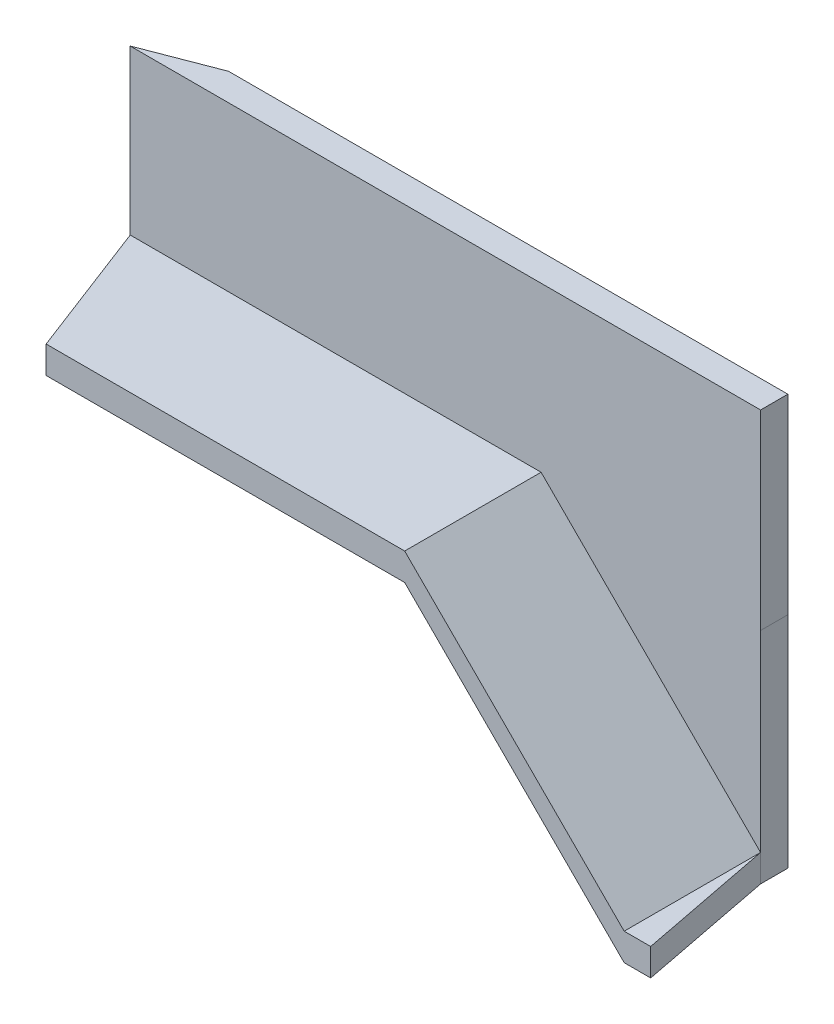
ISO-10303-21;
HEADER;
FILE_DESCRIPTION(('STEP AP214'),'2;1');
FILE_NAME('part.step','',(''),(''),'','','');
FILE_SCHEMA(('AUTOMOTIVE_DESIGN { 1 0 10303 214 1 1 1 1 }'));
ENDSEC;
DATA;
#1=APPLICATION_CONTEXT('core data for automotive mechanical design processes');
#2=APPLICATION_PROTOCOL_DEFINITION('international standard','automotive_design',2000,#1);
#3=PRODUCT_CONTEXT('',#1,'mechanical');
#4=PRODUCT('Part','Part','',(#3));
#5=PRODUCT_RELATED_PRODUCT_CATEGORY('part','',(#4));
#6=PRODUCT_DEFINITION_FORMATION('','',#4);
#7=PRODUCT_DEFINITION_CONTEXT('part definition',#1,'design');
#8=PRODUCT_DEFINITION('design','',#6,#7);
#9=PRODUCT_DEFINITION_SHAPE('','',#8);
#10=(LENGTH_UNIT() NAMED_UNIT(*) SI_UNIT(.MILLI.,.METRE.));
#11=(NAMED_UNIT(*) PLANE_ANGLE_UNIT() SI_UNIT($,.RADIAN.));
#12=(NAMED_UNIT(*) SI_UNIT($,.STERADIAN.) SOLID_ANGLE_UNIT());
#13=UNCERTAINTY_MEASURE_WITH_UNIT(LENGTH_MEASURE(1.E-05),#10,'distance_accuracy_value','');
#14=(GEOMETRIC_REPRESENTATION_CONTEXT(3) GLOBAL_UNCERTAINTY_ASSIGNED_CONTEXT((#13)) GLOBAL_UNIT_ASSIGNED_CONTEXT((#10,
#11,#12)) REPRESENTATION_CONTEXT('',''));
#15=CARTESIAN_POINT('',(0.,0.,0.));
#16=DIRECTION('',(0.,0.,1.));
#17=DIRECTION('',(1.,0.,0.));
#18=AXIS2_PLACEMENT_3D('',#15,#16,#17);
#19=CARTESIAN_POINT('',(0.,-15.3089430894309,2.));
#20=DIRECTION('',(0.,0.,1.));
#21=DIRECTION('',(1.,0.,0.));
#22=AXIS2_PLACEMENT_3D('',#19,#20,#21);
#23=PLANE('',#22);
#24=DIRECTION('',(3.40150407365471E-05,-0.999999999421489,0.));
#25=VECTOR('',#24,1.);
#26=CARTESIAN_POINT('',(22.8216855133879,-37.7444715447155,2.));
#27=LINE('',#26,#25);
#28=CARTESIAN_POINT('',(22.8211382113821,-21.6544715447155,2.));
#29=VERTEX_POINT('',#28);
#30=CARTESIAN_POINT('',(22.8214976653253,-35.7444715458725,2.0018487571625));
#31=VERTEX_POINT('',#30);
#32=EDGE_CURVE('E229',#29,#31,#27,.T.);
#33=ORIENTED_EDGE('',*,*,#32,.F.);
#34=DIRECTION('',(0.,-1.,0.));
#35=VECTOR('',#34,1.);
#36=CARTESIAN_POINT('',(22.8211382113821,-21.6544715447155,2.));
#37=LINE('',#36,#35);
#38=CARTESIAN_POINT('',(22.8211382113821,-7.65447154471545,2.));
#39=VERTEX_POINT('',#38);
#40=EDGE_CURVE('E209',#39,#29,#37,.T.);
#41=ORIENTED_EDGE('',*,*,#40,.F.);
#42=DIRECTION('',(1.,0.,0.));
#43=VECTOR('',#42,1.);
#44=CARTESIAN_POINT('',(-46.1788617886179,-7.65447154471545,2.));
#45=LINE('',#44,#43);
#46=CARTESIAN_POINT('',(-23.3890399180056,-7.65447154471545,2.));
#47=VERTEX_POINT('',#46);
#48=EDGE_CURVE('E213',#47,#39,#45,.T.);
#49=ORIENTED_EDGE('',*,*,#48,.F.);
#50=DIRECTION('',(0.,1.,0.));
#51=VECTOR('',#50,1.);
#52=CARTESIAN_POINT('',(-23.3890399180056,-15.3089430894309,2.));
#53=LINE('',#52,#51);
#54=CARTESIAN_POINT('',(-23.3890399180056,-19.6544715447155,2.));
#55=VERTEX_POINT('',#54);
#56=EDGE_CURVE('E216',#55,#47,#53,.T.);
#57=ORIENTED_EDGE('',*,*,#56,.F.);
#58=DIRECTION('',(1.,0.,0.));
#59=VECTOR('',#58,1.);
#60=CARTESIAN_POINT('',(-46.1788617886179,-19.6544715447155,2.));
#61=LINE('',#60,#59);
#62=CARTESIAN_POINT('',(6.73168551338772,-19.6544715447155,2.));
#63=VERTEX_POINT('',#62);
#64=EDGE_CURVE('E205',#55,#63,#61,.T.);
#65=ORIENTED_EDGE('',*,*,#64,.T.);
#66=DIRECTION('',(0.707105286298341,-0.707108276071594,0.));
#67=VECTOR('',#66,1.);
#68=CARTESIAN_POINT('',(6.73168551338772,-19.6544715447155,2.));
#69=LINE('',#68,#67);
#70=EDGE_CURVE('E218',#63,#31,#69,.T.);
#71=ORIENTED_EDGE('',*,*,#70,.T.);
#72=EDGE_LOOP('',(#33,#41,#49,#57,#65,#71));
#73=FACE_BOUND('',#72,.T.);
#74=ADVANCED_FACE('F40',(#73),#23,.T.);
#75=CARTESIAN_POINT('',(-46.1788617886179,-21.6544715447155,2.));
#76=DIRECTION('',(0.,1.,0.));
#77=DIRECTION('',(0.,0.,-1.));
#78=AXIS2_PLACEMENT_3D('',#75,#76,#77);
#79=PLANE('',#78);
#80=DIRECTION('',(0.933580426497204,0.,-0.358367949545294));
#81=VECTOR('',#80,1.);
#82=CARTESIAN_POINT('',(-43.2520199516604,-21.6544715447155,9.62468366354648));
#83=LINE('',#82,#81);
#84=CARTESIAN_POINT('',(-23.3890399180056,-21.6544715447155,2.));
#85=VERTEX_POINT('',#84);
#86=CARTESIAN_POINT('',(-18.1788617886179,-21.6544715447155,0.));
#87=VERTEX_POINT('',#86);
#88=EDGE_CURVE('E192',#85,#87,#83,.T.);
#89=ORIENTED_EDGE('',*,*,#88,.T.);
#90=DIRECTION('',(-1.,0.,0.));
#91=VECTOR('',#90,1.);
#92=CARTESIAN_POINT('',(-46.1788617886179,-21.6544715447155,0.));
#93=LINE('',#92,#91);
#94=CARTESIAN_POINT('',(6.73168551338772,-21.6544715447155,0.));
#95=VERTEX_POINT('',#94);
#96=EDGE_CURVE('E198',#95,#87,#93,.T.);
#97=ORIENTED_EDGE('',*,*,#96,.F.);
#98=DIRECTION('',(0.,0.,-1.));
#99=VECTOR('',#98,1.);
#100=CARTESIAN_POINT('',(6.73168551338772,-21.6544715447155,6.));
#101=LINE('',#100,#99);
#102=CARTESIAN_POINT('',(6.73168551338772,-21.6544715447155,12.));
#103=VERTEX_POINT('',#102);
#104=EDGE_CURVE('E202',#103,#95,#101,.T.);
#105=ORIENTED_EDGE('',*,*,#104,.F.);
#106=DIRECTION('',(-1.,0.,0.));
#107=VECTOR('',#106,1.);
#108=CARTESIAN_POINT('',(6.73168551338772,-21.6544715447155,12.));
#109=LINE('',#108,#107);
#110=CARTESIAN_POINT('',(-19.551979619052,-21.6544715447155,12.));
#111=VERTEX_POINT('',#110);
#112=EDGE_CURVE('E239',#103,#111,#109,.T.);
#113=ORIENTED_EDGE('',*,*,#112,.T.);
#114=DIRECTION('',(0.358239373263557,0.,0.933629772149396));
#115=VECTOR('',#114,1.);
#116=CARTESIAN_POINT('',(-26.313781930288,-21.6544715447155,-5.6223509259941));
#117=LINE('',#116,#115);
#118=EDGE_CURVE('E212',#85,#111,#117,.T.);
#119=ORIENTED_EDGE('',*,*,#118,.F.);
#120=EDGE_LOOP('',(#89,#97,#105,#113,#119));
#121=FACE_BOUND('',#120,.T.);
#122=ADVANCED_FACE('F42',(#121),#79,.F.);
#123=CARTESIAN_POINT('',(-46.1788617886179,-7.65447154471545,2.));
#124=DIRECTION('',(0.,-1.,0.));
#125=DIRECTION('',(0.,0.,1.));
#126=AXIS2_PLACEMENT_3D('',#123,#124,#125);
#127=PLANE('',#126);
#128=DIRECTION('',(-0.933580426497204,0.,0.358367949545294));
#129=VECTOR('',#128,1.);
#130=CARTESIAN_POINT('',(-43.2520199516604,-7.65447154471545,9.62468366354648));
#131=LINE('',#130,#129);
#132=CARTESIAN_POINT('',(-18.1788617886179,-7.65447154471545,0.));
#133=VERTEX_POINT('',#132);
#134=EDGE_CURVE('E223',#133,#47,#131,.T.);
#135=ORIENTED_EDGE('',*,*,#134,.T.);
#136=ORIENTED_EDGE('',*,*,#48,.T.);
#137=DIRECTION('',(0.,0.,-1.));
#138=VECTOR('',#137,1.);
#139=CARTESIAN_POINT('',(22.8211382113821,-7.65447154471545,2.));
#140=LINE('',#139,#138);
#141=CARTESIAN_POINT('',(22.8211382113821,-7.65447154471545,0.));
#142=VERTEX_POINT('',#141);
#143=EDGE_CURVE('E189',#39,#142,#140,.T.);
#144=ORIENTED_EDGE('',*,*,#143,.T.);
#145=DIRECTION('',(1.,0.,0.));
#146=VECTOR('',#145,1.);
#147=CARTESIAN_POINT('',(-46.1788617886179,-7.65447154471545,0.));
#148=LINE('',#147,#146);
#149=EDGE_CURVE('E201',#133,#142,#148,.T.);
#150=ORIENTED_EDGE('',*,*,#149,.F.);
#151=EDGE_LOOP('',(#135,#136,#144,#150));
#152=FACE_BOUND('',#151,.T.);
#153=ADVANCED_FACE('F297',(#152),#127,.F.);
#154=CARTESIAN_POINT('',(0.,-15.3089430894309,0.));
#155=DIRECTION('',(0.,0.,1.));
#156=DIRECTION('',(1.,0.,0.));
#157=AXIS2_PLACEMENT_3D('',#154,#155,#156);
#158=PLANE('',#157);
#159=DIRECTION('',(0.,1.,0.));
#160=VECTOR('',#159,1.);
#161=CARTESIAN_POINT('',(-18.1788617886179,-41.6544715447154,0.));
#162=LINE('',#161,#160);
#163=EDGE_CURVE('E226',#87,#133,#162,.T.);
#164=ORIENTED_EDGE('',*,*,#163,.T.);
#165=ORIENTED_EDGE('',*,*,#149,.T.);
#166=DIRECTION('',(0.,-1.,0.));
#167=VECTOR('',#166,1.);
#168=CARTESIAN_POINT('',(22.8211382113821,-21.6544715447155,0.));
#169=LINE('',#168,#167);
#170=CARTESIAN_POINT('',(22.8211382113821,-21.6544715447155,0.));
#171=VERTEX_POINT('',#170);
#172=EDGE_CURVE('E193',#142,#171,#169,.T.);
#173=ORIENTED_EDGE('',*,*,#172,.T.);
#174=DIRECTION('',(-3.40150407365471E-05,0.999999999421489,0.));
#175=VECTOR('',#174,1.);
#176=CARTESIAN_POINT('',(22.8216855133879,-37.7444715447155,0.));
#177=LINE('',#176,#175);
#178=CARTESIAN_POINT('',(22.8216855133879,-37.7444715447155,0.));
#179=VERTEX_POINT('',#178);
#180=EDGE_CURVE('E222',#179,#171,#177,.T.);
#181=ORIENTED_EDGE('',*,*,#180,.F.);
#182=DIRECTION('',(0.707106781186551,-0.707106781186544,0.));
#183=VECTOR('',#182,1.);
#184=CARTESIAN_POINT('',(6.73168551338772,-21.6544715447155,0.));
#185=LINE('',#184,#183);
#186=EDGE_CURVE('E208',#95,#179,#185,.T.);
#187=ORIENTED_EDGE('',*,*,#186,.F.);
#188=ORIENTED_EDGE('',*,*,#96,.T.);
#189=EDGE_LOOP('',(#164,#165,#173,#181,#187,#188));
#190=FACE_BOUND('',#189,.T.);
#191=ADVANCED_FACE('F289',(#190),#158,.F.);
#192=CARTESIAN_POINT('',(-46.1788617886179,-19.6544715447155,6.));
#193=DIRECTION('',(0.,-1.,0.));
#194=DIRECTION('',(0.,0.,1.));
#195=AXIS2_PLACEMENT_3D('',#192,#193,#194);
#196=PLANE('',#195);
#197=DIRECTION('',(1.,0.,0.));
#198=VECTOR('',#197,1.);
#199=CARTESIAN_POINT('',(-21.8542157984241,-19.6544715447155,12.));
#200=LINE('',#199,#198);
#201=CARTESIAN_POINT('',(-19.551979619052,-19.6544715447155,12.));
#202=VERTEX_POINT('',#201);
#203=CARTESIAN_POINT('',(6.73168551338772,-19.6544715447155,12.));
#204=VERTEX_POINT('',#203);
#205=EDGE_CURVE('E235',#202,#204,#200,.T.);
#206=ORIENTED_EDGE('',*,*,#205,.T.);
#207=DIRECTION('',(0.,0.,-1.));
#208=VECTOR('',#207,1.);
#209=CARTESIAN_POINT('',(6.73168551338772,-19.6544715447155,6.));
#210=LINE('',#209,#208);
#211=EDGE_CURVE('E196',#204,#63,#210,.T.);
#212=ORIENTED_EDGE('',*,*,#211,.T.);
#213=ORIENTED_EDGE('',*,*,#64,.F.);
#214=DIRECTION('',(0.358239373263557,0.,0.933629772149396));
#215=VECTOR('',#214,1.);
#216=CARTESIAN_POINT('',(-21.8542157984241,-19.6544715447155,6.));
#217=LINE('',#216,#215);
#218=EDGE_CURVE('E188',#55,#202,#217,.T.);
#219=ORIENTED_EDGE('',*,*,#218,.T.);
#220=EDGE_LOOP('',(#206,#212,#213,#219));
#221=FACE_BOUND('',#220,.T.);
#222=ADVANCED_FACE('F287',(#221),#196,.F.);
#223=CARTESIAN_POINT('',(22.8211382113821,-21.6544715447155,2.));
#224=DIRECTION('',(-1.,0.,0.));
#225=DIRECTION('',(0.,0.,1.));
#226=AXIS2_PLACEMENT_3D('',#223,#224,#225);
#227=PLANE('',#226);
#228=ORIENTED_EDGE('',*,*,#172,.F.);
#229=ORIENTED_EDGE('',*,*,#143,.F.);
#230=ORIENTED_EDGE('',*,*,#40,.T.);
#231=DIRECTION('',(0.,0.,-1.));
#232=VECTOR('',#231,1.);
#233=CARTESIAN_POINT('',(22.8211382113821,-21.6544715447155,2.));
#234=LINE('',#233,#232);
#235=EDGE_CURVE('E194',#29,#171,#234,.T.);
#236=ORIENTED_EDGE('',*,*,#235,.T.);
#237=EDGE_LOOP('',(#228,#229,#230,#236));
#238=FACE_BOUND('',#237,.T.);
#239=ADVANCED_FACE('F285',(#238),#227,.F.);
#240=CARTESIAN_POINT('',(-18.1788617886179,-41.6544715447154,0.));
#241=DIRECTION('',(-0.358367949545294,0.,-0.933580426497204));
#242=DIRECTION('',(-0.933580426497204,0.,0.358367949545294));
#243=AXIS2_PLACEMENT_3D('',#240,#241,#242);
#244=PLANE('',#243);
#245=DIRECTION('',(0.,1.,0.));
#246=VECTOR('',#245,1.);
#247=CARTESIAN_POINT('',(-23.3890399180056,-41.6544715447154,2.));
#248=LINE('',#247,#246);
#249=EDGE_CURVE('E51',#85,#55,#248,.T.);
#250=ORIENTED_EDGE('',*,*,#249,.T.);
#251=ORIENTED_EDGE('',*,*,#56,.T.);
#252=ORIENTED_EDGE('',*,*,#134,.F.);
#253=ORIENTED_EDGE('',*,*,#163,.F.);
#254=ORIENTED_EDGE('',*,*,#88,.F.);
#255=EDGE_LOOP('',(#250,#251,#252,#253,#254));
#256=FACE_BOUND('',#255,.T.);
#257=ADVANCED_FACE('F272',(#256),#244,.T.);
#258=CARTESIAN_POINT('',(6.73168551338772,-21.6544715447155,-22.7546962185832));
#259=DIRECTION('',(-0.707106781186544,-0.707106781186551,0.));
#260=DIRECTION('',(-0.707106781186551,0.707106781186544,0.));
#261=AXIS2_PLACEMENT_3D('',#258,#259,#260);
#262=PLANE('',#261);
#263=CARTESIAN_POINT('',(22.8211383462951,-37.7439243776227,2.00281495689551));
#264=DIRECTION('',(4.7927192318961E-05,-4.7927192318961E-05,0.999999997702984));
#265=VECTOR('',#264,1.);
#266=LINE('',#263,#265);
#267=CARTESIAN_POINT('',(22.8216854947647,-37.7439240453438,2.00281480866327));
#268=VERTEX_POINT('',#267);
#269=CARTESIAN_POINT('',(22.8216514983471,-37.7444375296747,12.));
#270=VERTEX_POINT('',#269);
#271=EDGE_CURVE('E133',#268,#270,#266,.T.);
#272=ORIENTED_EDGE('',*,*,#271,.T.);
#273=DIRECTION('',(-0.707106781186551,0.707106781186544,0.));
#274=VECTOR('',#273,1.);
#275=CARTESIAN_POINT('',(22.8216855133879,-37.7444715447155,12.));
#276=LINE('',#275,#274);
#277=EDGE_CURVE('E88',#270,#103,#276,.T.);
#278=ORIENTED_EDGE('',*,*,#277,.T.);
#279=ORIENTED_EDGE('',*,*,#104,.T.);
#280=ORIENTED_EDGE('',*,*,#186,.T.);
#281=DIRECTION('',(0.,0.,1.));
#282=VECTOR('',#281,1.);
#283=CARTESIAN_POINT('',(22.8216855133879,-37.7444715447155,-22.7546962185832));
#284=LINE('',#283,#282);
#285=EDGE_CURVE('E225',#179,#268,#284,.T.);
#286=ORIENTED_EDGE('',*,*,#285,.T.);
#287=EDGE_LOOP('',(#272,#278,#279,#280,#286));
#288=FACE_BOUND('',#287,.T.);
#289=ADVANCED_FACE('F262',(#288),#262,.T.);
#290=CARTESIAN_POINT('',(22.8216855133879,-37.7444715447155,-22.7546962185832));
#291=DIRECTION('',(0.999999999421488,3.40150407365471E-05,0.));
#292=DIRECTION('',(3.40150407365471E-05,-0.999999999421489,0.));
#293=AXIS2_PLACEMENT_3D('',#290,#291,#292);
#294=PLANE('',#293);
#295=CARTESIAN_POINT('',(22.8216174833064,-35.7444715458725,2.00246500955003));
#296=DIRECTION('',(3.40150402163412E-05,-0.999999984118184,0.00017494744575232));
#297=VECTOR('',#296,1.);
#298=LINE('',#295,#297);
#299=EDGE_CURVE('E11',#31,#268,#298,.T.);
#300=ORIENTED_EDGE('',*,*,#299,.T.);
#301=ORIENTED_EDGE('',*,*,#285,.F.);
#302=ORIENTED_EDGE('',*,*,#180,.T.);
#303=ORIENTED_EDGE('',*,*,#235,.F.);
#304=ORIENTED_EDGE('',*,*,#32,.T.);
#305=EDGE_LOOP('',(#300,#301,#302,#303,#304));
#306=FACE_BOUND('',#305,.T.);
#307=ADVANCED_FACE('F271',(#306),#294,.T.);
#308=CARTESIAN_POINT('',(6.73168551338772,-19.6544715447155,30.2102498954473));
#309=DIRECTION('',(-0.707108276071594,-0.707105286298341,0.));
#310=DIRECTION('',(-0.707105286298341,0.707108276071594,0.));
#311=AXIS2_PLACEMENT_3D('',#308,#309,#310);
#312=PLANE('',#311);
#313=CARTESIAN_POINT('',(22.8216174833064,-35.7444715458725,12.));
#314=DIRECTION('',(0.,0.,-1.));
#315=VECTOR('',#314,1.);
#316=LINE('',#313,#315);
#317=CARTESIAN_POINT('',(22.8216174833064,-35.7444715458725,12.));
#318=VERTEX_POINT('',#317);
#319=EDGE_CURVE('E197',#318,#31,#316,.T.);
#320=ORIENTED_EDGE('',*,*,#319,.T.);
#321=ORIENTED_EDGE('',*,*,#70,.F.);
#322=ORIENTED_EDGE('',*,*,#211,.F.);
#323=DIRECTION('',(0.707105286298341,-0.707108276071594,0.));
#324=VECTOR('',#323,1.);
#325=CARTESIAN_POINT('',(6.73168551338772,-19.6544715447155,12.));
#326=LINE('',#325,#324);
#327=EDGE_CURVE('E238',#204,#318,#326,.T.);
#328=ORIENTED_EDGE('',*,*,#327,.T.);
#329=EDGE_LOOP('',(#320,#321,#322,#328));
#330=FACE_BOUND('',#329,.T.);
#331=ADVANCED_FACE('F275',(#330),#312,.F.);
#332=CARTESIAN_POINT('',(0.,-15.3089430894309,12.));
#333=DIRECTION('',(0.,0.,1.));
#334=DIRECTION('',(1.,0.,0.));
#335=AXIS2_PLACEMENT_3D('',#332,#333,#334);
#336=PLANE('',#335);
#337=ORIENTED_EDGE('',*,*,#327,.F.);
#338=ORIENTED_EDGE('',*,*,#205,.F.);
#339=DIRECTION('',(0.,-1.,0.));
#340=VECTOR('',#339,1.);
#341=CARTESIAN_POINT('',(-19.551979619052,-15.3089430894309,12.));
#342=LINE('',#341,#340);
#343=EDGE_CURVE('E185',#202,#111,#342,.T.);
#344=ORIENTED_EDGE('',*,*,#343,.T.);
#345=ORIENTED_EDGE('',*,*,#112,.F.);
#346=ORIENTED_EDGE('',*,*,#277,.F.);
#347=DIRECTION('',(-1.,0.,0.));
#348=VECTOR('',#347,1.);
#349=CARTESIAN_POINT('',(22.8216174833064,-37.7444715458725,12.));
#350=LINE('',#349,#348);
#351=CARTESIAN_POINT('',(24.765438687986,-37.7444715458725,12.));
#352=VERTEX_POINT('',#351);
#353=EDGE_CURVE('E78',#352,#270,#350,.T.);
#354=ORIENTED_EDGE('',*,*,#353,.F.);
#355=DIRECTION('',(0.,1.,0.));
#356=VECTOR('',#355,1.);
#357=CARTESIAN_POINT('',(24.765438687986,-37.7444715458725,12.));
#358=LINE('',#357,#356);
#359=CARTESIAN_POINT('',(24.765438687986,-35.7444715458725,12.));
#360=VERTEX_POINT('',#359);
#361=EDGE_CURVE('E138',#352,#360,#358,.T.);
#362=ORIENTED_EDGE('',*,*,#361,.T.);
#363=DIRECTION('',(-1.,0.,0.));
#364=VECTOR('',#363,1.);
#365=CARTESIAN_POINT('',(22.8216174833064,-35.7444715458725,12.));
#366=LINE('',#365,#364);
#367=EDGE_CURVE('E135',#360,#318,#366,.T.);
#368=ORIENTED_EDGE('',*,*,#367,.T.);
#369=EDGE_LOOP('',(#337,#338,#344,#345,#346,#354,#362,#368));
#370=FACE_BOUND('',#369,.T.);
#371=ADVANCED_FACE('F144',(#370),#336,.T.);
#372=CARTESIAN_POINT('',(-21.8542157984241,-25.6544715447155,6.));
#373=DIRECTION('',(0.933629772149396,0.,-0.358239373263557));
#374=DIRECTION('',(-0.358239373263557,0.,-0.933629772149396));
#375=AXIS2_PLACEMENT_3D('',#372,#373,#374);
#376=PLANE('',#375);
#377=ORIENTED_EDGE('',*,*,#343,.F.);
#378=ORIENTED_EDGE('',*,*,#218,.F.);
#379=ORIENTED_EDGE('',*,*,#249,.F.);
#380=ORIENTED_EDGE('',*,*,#118,.T.);
#381=EDGE_LOOP('',(#377,#378,#379,#380));
#382=FACE_BOUND('',#381,.T.);
#383=ADVANCED_FACE('F168',(#382),#376,.F.);
#384=CARTESIAN_POINT('',(0.,-35.7444715458725,0.));
#385=DIRECTION('',(0.,-1.,0.));
#386=DIRECTION('',(0.,0.,1.));
#387=AXIS2_PLACEMENT_3D('',#384,#385,#386);
#388=PLANE('',#387);
#389=ORIENTED_EDGE('',*,*,#367,.F.);
#390=DIRECTION('',(0.190856041792253,0.,0.981618037380831));
#391=VECTOR('',#390,1.);
#392=CARTESIAN_POINT('',(24.765438687986,-35.7444715458725,12.));
#393=LINE('',#392,#391);
#394=EDGE_CURVE('E140',#31,#360,#393,.T.);
#395=ORIENTED_EDGE('',*,*,#394,.F.);
#396=ORIENTED_EDGE('',*,*,#319,.F.);
#397=EDGE_LOOP('',(#389,#395,#396));
#398=FACE_BOUND('',#397,.T.);
#399=ADVANCED_FACE('F164',(#398),#388,.F.);
#400=CARTESIAN_POINT('',(24.765438687986,-37.7444715458725,12.));
#401=DIRECTION('',(0.981618037380831,0.,-0.190856041792253));
#402=DIRECTION('',(-0.190856041792253,0.,-0.981618037380831));
#403=AXIS2_PLACEMENT_3D('',#400,#401,#402);
#404=PLANE('',#403);
#405=ORIENTED_EDGE('',*,*,#394,.T.);
#406=ORIENTED_EDGE('',*,*,#361,.F.);
#407=DIRECTION('',(0.190856041792253,0.,0.981618037380831));
#408=VECTOR('',#407,1.);
#409=CARTESIAN_POINT('',(24.765438687986,-37.7444715458725,12.));
#410=LINE('',#409,#408);
#411=EDGE_CURVE('E58',#268,#352,#410,.T.);
#412=ORIENTED_EDGE('',*,*,#411,.F.);
#413=ORIENTED_EDGE('',*,*,#299,.F.);
#414=EDGE_LOOP('',(#405,#406,#412,#413));
#415=FACE_BOUND('',#414,.T.);
#416=ADVANCED_FACE('F139',(#415),#404,.T.);
#417=CARTESIAN_POINT('',(0.,-37.7444715458725,0.));
#418=DIRECTION('',(0.,-1.,0.));
#419=DIRECTION('',(0.,0.,1.));
#420=AXIS2_PLACEMENT_3D('',#417,#418,#419);
#421=PLANE('',#420);
#422=ORIENTED_EDGE('',*,*,#411,.T.);
#423=ORIENTED_EDGE('',*,*,#353,.T.);
#424=ORIENTED_EDGE('',*,*,#271,.F.);
#425=EDGE_LOOP('',(#422,#423,#424));
#426=FACE_BOUND('',#425,.T.);
#427=ADVANCED_FACE('F132',(#426),#421,.T.);
#428=CLOSED_SHELL('',(#74,#122,#153,#191,#222,#239,#257,#289,#307,#331,#371,#383,#399,#416,#427));
#429=MANIFOLD_SOLID_BREP('B2',#428);
#430=ADVANCED_BREP_SHAPE_REPRESENTATION('',(#18,#429),#14);
#431=SHAPE_DEFINITION_REPRESENTATION(#9,#430);
ENDSEC;
END-ISO-10303-21;
